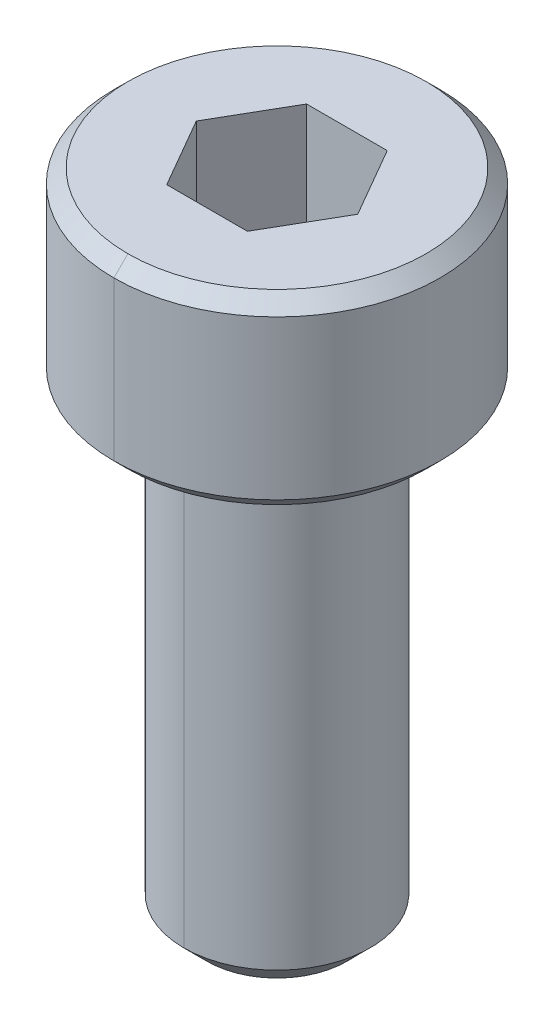
ISO-10303-21;
HEADER;
FILE_DESCRIPTION(('STEP AP214'),'2;1');
FILE_NAME('part.step','',(''),(''),'','','');
FILE_SCHEMA(('AUTOMOTIVE_DESIGN { 1 0 10303 214 1 1 1 1 }'));
ENDSEC;
DATA;
#1=APPLICATION_CONTEXT('core data for automotive mechanical design processes');
#2=APPLICATION_PROTOCOL_DEFINITION('international standard','automotive_design',2000,#1);
#3=PRODUCT_CONTEXT('',#1,'mechanical');
#4=PRODUCT('Part','Part','',(#3));
#5=PRODUCT_RELATED_PRODUCT_CATEGORY('part','',(#4));
#6=PRODUCT_DEFINITION_FORMATION('','',#4);
#7=PRODUCT_DEFINITION_CONTEXT('part definition',#1,'design');
#8=PRODUCT_DEFINITION('design','',#6,#7);
#9=PRODUCT_DEFINITION_SHAPE('','',#8);
#10=(LENGTH_UNIT() NAMED_UNIT(*) SI_UNIT(.MILLI.,.METRE.));
#11=(NAMED_UNIT(*) PLANE_ANGLE_UNIT() SI_UNIT($,.RADIAN.));
#12=(NAMED_UNIT(*) SI_UNIT($,.STERADIAN.) SOLID_ANGLE_UNIT());
#13=UNCERTAINTY_MEASURE_WITH_UNIT(LENGTH_MEASURE(1.E-05),#10,'distance_accuracy_value','');
#14=(GEOMETRIC_REPRESENTATION_CONTEXT(3) GLOBAL_UNCERTAINTY_ASSIGNED_CONTEXT((#13)) GLOBAL_UNIT_ASSIGNED_CONTEXT((#10,
#11,#12)) REPRESENTATION_CONTEXT('',''));
#15=CARTESIAN_POINT('',(0.,0.,0.));
#16=DIRECTION('',(0.,0.,1.));
#17=DIRECTION('',(1.,0.,0.));
#18=AXIS2_PLACEMENT_3D('',#15,#16,#17);
#19=CARTESIAN_POINT('',(0.866025403784439,11.,1.5));
#20=DIRECTION('',(0.866025403784439,0.,0.5));
#21=DIRECTION('',(0.5,0.,-0.866025403784439));
#22=AXIS2_PLACEMENT_3D('',#19,#20,#21);
#23=PLANE('',#22);
#24=DIRECTION('',(0.5,0.,-0.866025403784439));
#25=VECTOR('',#24,1.);
#26=CARTESIAN_POINT('',(0.866025403784439,11.,1.5));
#27=LINE('',#26,#25);
#28=CARTESIAN_POINT('',(0.866025403784439,11.,1.5));
#29=VERTEX_POINT('',#28);
#30=CARTESIAN_POINT('',(1.73205080756888,11.,0.));
#31=VERTEX_POINT('',#30);
#32=EDGE_CURVE('E179',#29,#31,#27,.T.);
#33=ORIENTED_EDGE('',*,*,#32,.F.);
#34=DIRECTION('',(0.,1.,0.));
#35=VECTOR('',#34,1.);
#36=CARTESIAN_POINT('',(0.866025403784439,11.,1.5));
#37=LINE('',#36,#35);
#38=CARTESIAN_POINT('',(0.866025403784439,14.,1.5));
#39=VERTEX_POINT('',#38);
#40=EDGE_CURVE('E167',#29,#39,#37,.T.);
#41=ORIENTED_EDGE('',*,*,#40,.T.);
#42=DIRECTION('',(0.5,0.,-0.866025403784439));
#43=VECTOR('',#42,1.);
#44=CARTESIAN_POINT('',(0.866025403784439,14.,1.5));
#45=LINE('',#44,#43);
#46=CARTESIAN_POINT('',(1.73205080756888,14.,0.));
#47=VERTEX_POINT('',#46);
#48=EDGE_CURVE('E181',#47,#39,#45,.F.);
#49=ORIENTED_EDGE('',*,*,#48,.F.);
#50=DIRECTION('',(0.,1.,0.));
#51=VECTOR('',#50,1.);
#52=CARTESIAN_POINT('',(1.73205080756888,11.,0.));
#53=LINE('',#52,#51);
#54=EDGE_CURVE('E174',#47,#31,#53,.F.);
#55=ORIENTED_EDGE('',*,*,#54,.T.);
#56=EDGE_LOOP('',(#33,#41,#49,#55));
#57=FACE_BOUND('',#56,.T.);
#58=ADVANCED_FACE('F17',(#57),#23,.F.);
#59=CARTESIAN_POINT('',(1.73205080756888,11.,0.));
#60=DIRECTION('',(0.866025403784438,0.,-0.5));
#61=DIRECTION('',(-0.5,0.,-0.866025403784438));
#62=AXIS2_PLACEMENT_3D('',#59,#60,#61);
#63=PLANE('',#62);
#64=DIRECTION('',(-0.5,0.,-0.866025403784438));
#65=VECTOR('',#64,1.);
#66=CARTESIAN_POINT('',(1.73205080756888,11.,0.));
#67=LINE('',#66,#65);
#68=CARTESIAN_POINT('',(0.866025403784438,11.,-1.5));
#69=VERTEX_POINT('',#68);
#70=EDGE_CURVE('E172',#31,#69,#67,.T.);
#71=ORIENTED_EDGE('',*,*,#70,.F.);
#72=ORIENTED_EDGE('',*,*,#54,.F.);
#73=DIRECTION('',(-0.5,0.,-0.866025403784438));
#74=VECTOR('',#73,1.);
#75=CARTESIAN_POINT('',(1.73205080756888,14.,0.));
#76=LINE('',#75,#74);
#77=CARTESIAN_POINT('',(0.866025403784439,14.,-1.5));
#78=VERTEX_POINT('',#77);
#79=EDGE_CURVE('E177',#78,#47,#76,.F.);
#80=ORIENTED_EDGE('',*,*,#79,.F.);
#81=DIRECTION('',(0.,1.,0.));
#82=VECTOR('',#81,1.);
#83=CARTESIAN_POINT('',(0.866025403784438,11.,-1.5));
#84=LINE('',#83,#82);
#85=EDGE_CURVE('E162',#78,#69,#84,.F.);
#86=ORIENTED_EDGE('',*,*,#85,.T.);
#87=EDGE_LOOP('',(#71,#72,#80,#86));
#88=FACE_BOUND('',#87,.T.);
#89=ADVANCED_FACE('F417',(#88),#63,.F.);
#90=CARTESIAN_POINT('',(-0.866025403784438,11.,1.5));
#91=DIRECTION('',(0.,0.,1.));
#92=DIRECTION('',(1.,0.,0.));
#93=AXIS2_PLACEMENT_3D('',#90,#91,#92);
#94=PLANE('',#93);
#95=DIRECTION('',(1.,0.,0.));
#96=VECTOR('',#95,1.);
#97=CARTESIAN_POINT('',(1.73205080756888,11.,1.5));
#98=LINE('',#97,#96);
#99=CARTESIAN_POINT('',(-0.866025403784438,11.,1.5));
#100=VERTEX_POINT('',#99);
#101=EDGE_CURVE('E159',#100,#29,#98,.T.);
#102=ORIENTED_EDGE('',*,*,#101,.F.);
#103=DIRECTION('',(0.,1.,0.));
#104=VECTOR('',#103,1.);
#105=CARTESIAN_POINT('',(-0.866025403784438,11.,1.5));
#106=LINE('',#105,#104);
#107=CARTESIAN_POINT('',(-0.866025403784438,14.,1.5));
#108=VERTEX_POINT('',#107);
#109=EDGE_CURVE('E148',#100,#108,#106,.T.);
#110=ORIENTED_EDGE('',*,*,#109,.T.);
#111=DIRECTION('',(1.,0.,0.));
#112=VECTOR('',#111,1.);
#113=CARTESIAN_POINT('',(-0.866025403784438,14.,1.5));
#114=LINE('',#113,#112);
#115=EDGE_CURVE('E170',#39,#108,#114,.F.);
#116=ORIENTED_EDGE('',*,*,#115,.F.);
#117=ORIENTED_EDGE('',*,*,#40,.F.);
#118=EDGE_LOOP('',(#102,#110,#116,#117));
#119=FACE_BOUND('',#118,.T.);
#120=ADVANCED_FACE('F408',(#119),#94,.F.);
#121=CARTESIAN_POINT('',(0.866025403784438,11.,-1.5));
#122=DIRECTION('',(0.,0.,-1.));
#123=DIRECTION('',(-1.,0.,0.));
#124=AXIS2_PLACEMENT_3D('',#121,#122,#123);
#125=PLANE('',#124);
#126=DIRECTION('',(1.,0.,0.));
#127=VECTOR('',#126,1.);
#128=CARTESIAN_POINT('',(1.73205080756888,11.,-1.5));
#129=LINE('',#128,#127);
#130=CARTESIAN_POINT('',(-0.866025403784438,11.,-1.5));
#131=VERTEX_POINT('',#130);
#132=EDGE_CURVE('E156',#69,#131,#129,.F.);
#133=ORIENTED_EDGE('',*,*,#132,.F.);
#134=ORIENTED_EDGE('',*,*,#85,.F.);
#135=DIRECTION('',(-1.,0.,0.));
#136=VECTOR('',#135,1.);
#137=CARTESIAN_POINT('',(0.866025403784438,14.,-1.5));
#138=LINE('',#137,#136);
#139=CARTESIAN_POINT('',(-0.866025403784438,14.,-1.5));
#140=VERTEX_POINT('',#139);
#141=EDGE_CURVE('E165',#140,#78,#138,.F.);
#142=ORIENTED_EDGE('',*,*,#141,.F.);
#143=DIRECTION('',(0.,1.,0.));
#144=VECTOR('',#143,1.);
#145=CARTESIAN_POINT('',(-0.866025403784438,11.,-1.5));
#146=LINE('',#145,#144);
#147=EDGE_CURVE('E146',#140,#131,#146,.F.);
#148=ORIENTED_EDGE('',*,*,#147,.T.);
#149=EDGE_LOOP('',(#133,#134,#142,#148));
#150=FACE_BOUND('',#149,.T.);
#151=ADVANCED_FACE('F399',(#150),#125,.F.);
#152=CARTESIAN_POINT('',(1.73205080756888,11.,0.));
#153=DIRECTION('',(0.,1.,0.));
#154=DIRECTION('',(0.,0.,1.));
#155=AXIS2_PLACEMENT_3D('',#152,#153,#154);
#156=PLANE('',#155);
#157=ORIENTED_EDGE('',*,*,#132,.T.);
#158=DIRECTION('',(-0.5,0.,0.866025403784439));
#159=VECTOR('',#158,1.);
#160=CARTESIAN_POINT('',(-0.866025403784438,11.,-1.5));
#161=LINE('',#160,#159);
#162=CARTESIAN_POINT('',(-1.73205080756888,11.,0.));
#163=VERTEX_POINT('',#162);
#164=EDGE_CURVE('E144',#131,#163,#161,.T.);
#165=ORIENTED_EDGE('',*,*,#164,.T.);
#166=DIRECTION('',(0.5,0.,0.866025403784439));
#167=VECTOR('',#166,1.);
#168=CARTESIAN_POINT('',(-1.73205080756888,11.,0.));
#169=LINE('',#168,#167);
#170=EDGE_CURVE('E151',#163,#100,#169,.T.);
#171=ORIENTED_EDGE('',*,*,#170,.T.);
#172=ORIENTED_EDGE('',*,*,#101,.T.);
#173=ORIENTED_EDGE('',*,*,#32,.T.);
#174=ORIENTED_EDGE('',*,*,#70,.T.);
#175=EDGE_LOOP('',(#157,#165,#171,#172,#173,#174));
#176=FACE_BOUND('',#175,.T.);
#177=ADVANCED_FACE('F390',(#176),#156,.T.);
#178=CARTESIAN_POINT('',(-1.73205080756888,11.,0.));
#179=DIRECTION('',(-0.866025403784439,0.,0.5));
#180=DIRECTION('',(0.5,0.,0.866025403784439));
#181=AXIS2_PLACEMENT_3D('',#178,#179,#180);
#182=PLANE('',#181);
#183=ORIENTED_EDGE('',*,*,#170,.F.);
#184=DIRECTION('',(0.,1.,0.));
#185=VECTOR('',#184,1.);
#186=CARTESIAN_POINT('',(-1.73205080756888,11.,0.));
#187=LINE('',#186,#185);
#188=CARTESIAN_POINT('',(-1.73205080756888,14.,0.));
#189=VERTEX_POINT('',#188);
#190=EDGE_CURVE('E141',#163,#189,#187,.T.);
#191=ORIENTED_EDGE('',*,*,#190,.T.);
#192=DIRECTION('',(0.5,0.,0.866025403784439));
#193=VECTOR('',#192,1.);
#194=CARTESIAN_POINT('',(-1.73205080756888,14.,0.));
#195=LINE('',#194,#193);
#196=EDGE_CURVE('E154',#108,#189,#195,.F.);
#197=ORIENTED_EDGE('',*,*,#196,.F.);
#198=ORIENTED_EDGE('',*,*,#109,.F.);
#199=EDGE_LOOP('',(#183,#191,#197,#198));
#200=FACE_BOUND('',#199,.T.);
#201=ADVANCED_FACE('F381',(#200),#182,.F.);
#202=CARTESIAN_POINT('',(-0.866025403784438,11.,-1.5));
#203=DIRECTION('',(-0.866025403784439,0.,-0.5));
#204=DIRECTION('',(-0.5,0.,0.866025403784439));
#205=AXIS2_PLACEMENT_3D('',#202,#203,#204);
#206=PLANE('',#205);
#207=ORIENTED_EDGE('',*,*,#164,.F.);
#208=ORIENTED_EDGE('',*,*,#147,.F.);
#209=DIRECTION('',(0.5,0.,-0.866025403784439));
#210=VECTOR('',#209,1.);
#211=CARTESIAN_POINT('',(-1.73205080756888,14.,0.));
#212=LINE('',#211,#210);
#213=EDGE_CURVE('E122',#189,#140,#212,.T.);
#214=ORIENTED_EDGE('',*,*,#213,.F.);
#215=ORIENTED_EDGE('',*,*,#190,.F.);
#216=EDGE_LOOP('',(#207,#208,#214,#215));
#217=FACE_BOUND('',#216,.T.);
#218=ADVANCED_FACE('F373',(#217),#206,.F.);
#219=CARTESIAN_POINT('',(0.,14.,-3.5));
#220=DIRECTION('',(0.,1.,0.));
#221=DIRECTION('',(0.,0.,1.));
#222=AXIS2_PLACEMENT_3D('',#219,#220,#221);
#223=PLANE('',#222);
#224=CARTESIAN_POINT('',(0.,13.9999999999532,0.));
#225=DIRECTION('',(0.,-1.,0.));
#226=DIRECTION('',(0.,0.,-1.));
#227=AXIS2_PLACEMENT_3D('',#224,#225,#226);
#228=CIRCLE('',#227,3.1999999999357);
#229=CARTESIAN_POINT('',(0.,13.9999999999532,-3.1999999999357));
#230=VERTEX_POINT('',#229);
#231=CARTESIAN_POINT('',(0.,13.9999999999532,3.1999999999357));
#232=VERTEX_POINT('',#231);
#233=EDGE_CURVE('E111',#230,#232,#228,.T.);
#234=ORIENTED_EDGE('',*,*,#233,.F.);
#235=CARTESIAN_POINT('',(0.,13.9999999999532,0.));
#236=DIRECTION('',(0.,-1.,0.));
#237=DIRECTION('',(0.,0.,-1.));
#238=AXIS2_PLACEMENT_3D('',#235,#236,#237);
#239=CIRCLE('',#238,3.1999999999357);
#240=EDGE_CURVE('E20',#232,#230,#239,.T.);
#241=ORIENTED_EDGE('',*,*,#240,.F.);
#242=EDGE_LOOP('',(#234,#241));
#243=FACE_BOUND('',#242,.T.);
#244=ORIENTED_EDGE('',*,*,#196,.T.);
#245=ORIENTED_EDGE('',*,*,#213,.T.);
#246=ORIENTED_EDGE('',*,*,#141,.T.);
#247=ORIENTED_EDGE('',*,*,#79,.T.);
#248=ORIENTED_EDGE('',*,*,#48,.T.);
#249=ORIENTED_EDGE('',*,*,#115,.T.);
#250=EDGE_LOOP('',(#244,#245,#246,#247,#248,#249));
#251=FACE_BOUND('',#250,.T.);
#252=ADVANCED_FACE('F112',(#243,#251),#223,.T.);
#253=CARTESIAN_POINT('',(0.,13.7000000000853,0.));
#254=DIRECTION('',(0.,-1.,0.));
#255=DIRECTION('',(0.,0.,-1.));
#256=AXIS2_PLACEMENT_3D('',#253,#254,#255);
#257=CONICAL_SURFACE('',#256,3.49999999980355,0.785398163397448);
#258=DIRECTION('',(0.,0.707106781186548,0.707106781186548));
#259=VECTOR('',#258,1.);
#260=CARTESIAN_POINT('',(0.,-498982.8,-499000.));
#261=LINE('',#260,#259);
#262=CARTESIAN_POINT('',(0.,13.7000000000213,-3.49999999995089));
#263=VERTEX_POINT('',#262);
#264=EDGE_CURVE('E120',#263,#230,#261,.T.);
#265=ORIENTED_EDGE('',*,*,#264,.F.);
#266=CARTESIAN_POINT('',(0.,13.7,0.));
#267=DIRECTION('',(0.,-1.,0.));
#268=DIRECTION('',(0.,0.,-1.));
#269=AXIS2_PLACEMENT_3D('',#266,#267,#268);
#270=CIRCLE('',#269,3.5);
#271=CARTESIAN_POINT('',(0.,13.7000000000213,3.49999999995089));
#272=VERTEX_POINT('',#271);
#273=EDGE_CURVE('E127',#272,#263,#270,.T.);
#274=ORIENTED_EDGE('',*,*,#273,.F.);
#275=DIRECTION('',(0.,0.707106781186548,-0.707106781186548));
#276=VECTOR('',#275,1.);
#277=CARTESIAN_POINT('',(6.11098752774529E-11,-498982.8,499000.));
#278=LINE('',#277,#276);
#279=EDGE_CURVE('E117',#232,#272,#278,.F.);
#280=ORIENTED_EDGE('',*,*,#279,.F.);
#281=ORIENTED_EDGE('',*,*,#240,.T.);
#282=EDGE_LOOP('',(#265,#274,#280,#281));
#283=FACE_BOUND('',#282,.T.);
#284=ADVANCED_FACE('F119',(#283),#257,.T.);
#285=CARTESIAN_POINT('',(0.,13.7000000000853,0.));
#286=DIRECTION('',(0.,-1.,0.));
#287=DIRECTION('',(0.,0.,-1.));
#288=AXIS2_PLACEMENT_3D('',#285,#286,#287);
#289=CONICAL_SURFACE('',#288,3.49999999980355,0.785398163397448);
#290=CARTESIAN_POINT('',(0.,13.7,0.));
#291=DIRECTION('',(0.,-1.,0.));
#292=DIRECTION('',(0.,0.,-1.));
#293=AXIS2_PLACEMENT_3D('',#290,#291,#292);
#294=CIRCLE('',#293,3.5);
#295=EDGE_CURVE('E125',#263,#272,#294,.T.);
#296=ORIENTED_EDGE('',*,*,#295,.F.);
#297=ORIENTED_EDGE('',*,*,#264,.T.);
#298=ORIENTED_EDGE('',*,*,#233,.T.);
#299=ORIENTED_EDGE('',*,*,#279,.T.);
#300=EDGE_LOOP('',(#296,#297,#298,#299));
#301=FACE_BOUND('',#300,.T.);
#302=ADVANCED_FACE('F123',(#301),#289,.T.);
#303=CARTESIAN_POINT('',(0.,0.,0.));
#304=DIRECTION('',(0.,-1.,0.));
#305=DIRECTION('',(0.,0.,-1.));
#306=AXIS2_PLACEMENT_3D('',#303,#304,#305);
#307=CYLINDRICAL_SURFACE('',#306,3.5);
#308=DIRECTION('',(0.,-1.,0.));
#309=VECTOR('',#308,1.);
#310=CARTESIAN_POINT('',(0.,0.,-3.5));
#311=LINE('',#310,#309);
#312=CARTESIAN_POINT('',(0.,10.2999999999298,-3.49999999995214));
#313=VERTEX_POINT('',#312);
#314=EDGE_CURVE('E226',#313,#263,#311,.F.);
#315=ORIENTED_EDGE('',*,*,#314,.F.);
#316=CARTESIAN_POINT('',(0.,10.2999999999724,0.));
#317=DIRECTION('',(0.,1.,0.));
#318=DIRECTION('',(0.,0.,1.));
#319=AXIS2_PLACEMENT_3D('',#316,#317,#318);
#320=CIRCLE('',#319,3.49999999997408);
#321=CARTESIAN_POINT('',(0.,10.299999999944,3.49999999995214));
#322=VERTEX_POINT('',#321);
#323=EDGE_CURVE('E221',#322,#313,#320,.F.);
#324=ORIENTED_EDGE('',*,*,#323,.F.);
#325=DIRECTION('',(0.,-1.,0.));
#326=VECTOR('',#325,1.);
#327=CARTESIAN_POINT('',(0.,0.,3.5));
#328=LINE('',#327,#326);
#329=EDGE_CURVE('E231',#272,#322,#328,.T.);
#330=ORIENTED_EDGE('',*,*,#329,.F.);
#331=ORIENTED_EDGE('',*,*,#273,.T.);
#332=EDGE_LOOP('',(#315,#324,#330,#331));
#333=FACE_BOUND('',#332,.T.);
#334=ADVANCED_FACE('F246',(#333),#307,.T.);
#335=CARTESIAN_POINT('',(0.,0.,0.));
#336=DIRECTION('',(0.,-1.,0.));
#337=DIRECTION('',(0.,0.,-1.));
#338=AXIS2_PLACEMENT_3D('',#335,#336,#337);
#339=CYLINDRICAL_SURFACE('',#338,3.5);
#340=CARTESIAN_POINT('',(0.,10.2999999999724,0.));
#341=DIRECTION('',(0.,1.,0.));
#342=DIRECTION('',(0.,0.,1.));
#343=AXIS2_PLACEMENT_3D('',#340,#341,#342);
#344=CIRCLE('',#343,3.49999999997408);
#345=EDGE_CURVE('E206',#313,#322,#344,.F.);
#346=ORIENTED_EDGE('',*,*,#345,.F.);
#347=ORIENTED_EDGE('',*,*,#314,.T.);
#348=ORIENTED_EDGE('',*,*,#295,.T.);
#349=ORIENTED_EDGE('',*,*,#329,.T.);
#350=EDGE_LOOP('',(#346,#347,#348,#349));
#351=FACE_BOUND('',#350,.T.);
#352=ADVANCED_FACE('F243',(#351),#339,.T.);
#353=CARTESIAN_POINT('',(0.,10.2999999998588,0.));
#354=DIRECTION('',(0.,1.,0.));
#355=DIRECTION('',(0.,0.,1.));
#356=AXIS2_PLACEMENT_3D('',#353,#354,#355);
#357=CONICAL_SURFACE('',#356,3.49999999986039,0.785398163397448);
#358=DIRECTION('',(0.,-0.707106781186548,-0.707106781186548));
#359=VECTOR('',#358,1.);
#360=CARTESIAN_POINT('',(0.,499000.,498993.2));
#361=LINE('',#360,#359);
#362=CARTESIAN_POINT('',(0.,9.99999999999091,3.19999999999254));
#363=VERTEX_POINT('',#362);
#364=EDGE_CURVE('E203',#322,#363,#361,.T.);
#365=ORIENTED_EDGE('',*,*,#364,.F.);
#366=ORIENTED_EDGE('',*,*,#323,.T.);
#367=DIRECTION('',(0.,-0.707106781186548,0.707106781186548));
#368=VECTOR('',#367,1.);
#369=CARTESIAN_POINT('',(6.11090425176295E-11,499000.,-498993.2));
#370=LINE('',#369,#368);
#371=CARTESIAN_POINT('',(0.,9.99999999999091,-3.19999999999254));
#372=VERTEX_POINT('',#371);
#373=EDGE_CURVE('E212',#372,#313,#370,.F.);
#374=ORIENTED_EDGE('',*,*,#373,.F.);
#375=CARTESIAN_POINT('',(0.,9.99999999999091,0.));
#376=DIRECTION('',(0.,1.,0.));
#377=DIRECTION('',(0.,0.,1.));
#378=AXIS2_PLACEMENT_3D('',#375,#376,#377);
#379=CIRCLE('',#378,3.19999999999254);
#380=EDGE_CURVE('E198',#363,#372,#379,.F.);
#381=ORIENTED_EDGE('',*,*,#380,.F.);
#382=EDGE_LOOP('',(#365,#366,#374,#381));
#383=FACE_BOUND('',#382,.T.);
#384=ADVANCED_FACE('F248',(#383),#357,.T.);
#385=CARTESIAN_POINT('',(0.,10.2999999998588,0.));
#386=DIRECTION('',(0.,1.,0.));
#387=DIRECTION('',(0.,0.,1.));
#388=AXIS2_PLACEMENT_3D('',#385,#386,#387);
#389=CONICAL_SURFACE('',#388,3.49999999986039,0.785398163397448);
#390=ORIENTED_EDGE('',*,*,#345,.T.);
#391=ORIENTED_EDGE('',*,*,#364,.T.);
#392=CARTESIAN_POINT('',(0.,9.99999999999091,0.));
#393=DIRECTION('',(0.,1.,0.));
#394=DIRECTION('',(0.,0.,1.));
#395=AXIS2_PLACEMENT_3D('',#392,#393,#394);
#396=CIRCLE('',#395,3.19999999999254);
#397=EDGE_CURVE('E195',#372,#363,#396,.F.);
#398=ORIENTED_EDGE('',*,*,#397,.F.);
#399=ORIENTED_EDGE('',*,*,#373,.T.);
#400=EDGE_LOOP('',(#390,#391,#398,#399));
#401=FACE_BOUND('',#400,.T.);
#402=ADVANCED_FACE('F249',(#401),#389,.T.);
#403=CARTESIAN_POINT('',(0.,0.,0.));
#404=DIRECTION('',(0.,-1.,0.));
#405=DIRECTION('',(0.,0.,-1.));
#406=AXIS2_PLACEMENT_3D('',#403,#404,#405);
#407=PLANE('',#406);
#408=CARTESIAN_POINT('',(0.,0.,0.));
#409=DIRECTION('',(0.,1.,0.));
#410=DIRECTION('',(0.,0.,1.));
#411=AXIS2_PLACEMENT_3D('',#408,#409,#410);
#412=CIRCLE('',#411,1.50000000002137);
#413=CARTESIAN_POINT('',(0.,0.,1.50000000002137));
#414=VERTEX_POINT('',#413);
#415=CARTESIAN_POINT('',(0.,0.,-1.50000000002137));
#416=VERTEX_POINT('',#415);
#417=EDGE_CURVE('E191',#414,#416,#412,.T.);
#418=ORIENTED_EDGE('',*,*,#417,.F.);
#419=CARTESIAN_POINT('',(0.,0.,0.));
#420=DIRECTION('',(0.,1.,0.));
#421=DIRECTION('',(0.,0.,1.));
#422=AXIS2_PLACEMENT_3D('',#419,#420,#421);
#423=CIRCLE('',#422,1.50000000002137);
#424=EDGE_CURVE('E201',#416,#414,#423,.T.);
#425=ORIENTED_EDGE('',*,*,#424,.F.);
#426=EDGE_LOOP('',(#418,#425));
#427=FACE_BOUND('',#426,.T.);
#428=ADVANCED_FACE('F271',(#427),#407,.T.);
#429=CARTESIAN_POINT('',(0.,0.499999999988177,0.));
#430=DIRECTION('',(0.,1.,0.));
#431=DIRECTION('',(0.,0.,1.));
#432=AXIS2_PLACEMENT_3D('',#429,#430,#431);
#433=CONICAL_SURFACE('',#432,2.00000000000955,0.785398163397448);
#434=DIRECTION('',(0.,-0.707106781146353,-0.707106781226742));
#435=VECTOR('',#434,1.);
#436=CARTESIAN_POINT('',(0.,498998.49994327,499000.));
#437=LINE('',#436,#435);
#438=CARTESIAN_POINT('',(0.,0.499999999992611,2.00000000000597));
#439=VERTEX_POINT('',#438);
#440=EDGE_CURVE('E190',#439,#414,#437,.T.);
#441=ORIENTED_EDGE('',*,*,#440,.F.);
#442=CARTESIAN_POINT('',(0.,0.500000000000002,0.));
#443=DIRECTION('',(0.,-1.,0.));
#444=DIRECTION('',(0.,0.,-1.));
#445=AXIS2_PLACEMENT_3D('',#442,#443,#444);
#446=CIRCLE('',#445,2.);
#447=CARTESIAN_POINT('',(0.,0.499999999991133,-2.00000000000716));
#448=VERTEX_POINT('',#447);
#449=EDGE_CURVE('E35',#448,#439,#446,.F.);
#450=ORIENTED_EDGE('',*,*,#449,.F.);
#451=DIRECTION('',(0.,-0.707106781146353,0.707106781226742));
#452=VECTOR('',#451,1.);
#453=CARTESIAN_POINT('',(6.11098752774529E-11,498998.49994327,-499000.));
#454=LINE('',#453,#452);
#455=EDGE_CURVE('E194',#416,#448,#454,.F.);
#456=ORIENTED_EDGE('',*,*,#455,.F.);
#457=ORIENTED_EDGE('',*,*,#424,.T.);
#458=EDGE_LOOP('',(#441,#450,#456,#457));
#459=FACE_BOUND('',#458,.T.);
#460=ADVANCED_FACE('F255',(#459),#433,.T.);
#461=CARTESIAN_POINT('',(0.,10.,-2.));
#462=DIRECTION('',(0.,-1.,0.));
#463=DIRECTION('',(0.,0.,-1.));
#464=AXIS2_PLACEMENT_3D('',#461,#462,#463);
#465=PLANE('',#464);
#466=ORIENTED_EDGE('',*,*,#380,.T.);
#467=ORIENTED_EDGE('',*,*,#397,.T.);
#468=EDGE_LOOP('',(#466,#467));
#469=FACE_BOUND('',#468,.T.);
#470=CARTESIAN_POINT('',(0.,10.,0.));
#471=DIRECTION('',(0.,-1.,0.));
#472=DIRECTION('',(0.,0.,-1.));
#473=AXIS2_PLACEMENT_3D('',#470,#471,#472);
#474=CIRCLE('',#473,2.);
#475=CARTESIAN_POINT('',(0.,10.,-2.));
#476=VERTEX_POINT('',#475);
#477=CARTESIAN_POINT('',(0.,10.,2.));
#478=VERTEX_POINT('',#477);
#479=EDGE_CURVE('E183',#476,#478,#474,.T.);
#480=ORIENTED_EDGE('',*,*,#479,.F.);
#481=CARTESIAN_POINT('',(0.,10.,0.));
#482=DIRECTION('',(0.,-1.,0.));
#483=DIRECTION('',(0.,0.,-1.));
#484=AXIS2_PLACEMENT_3D('',#481,#482,#483);
#485=CIRCLE('',#484,2.);
#486=EDGE_CURVE('E187',#478,#476,#485,.T.);
#487=ORIENTED_EDGE('',*,*,#486,.F.);
#488=EDGE_LOOP('',(#480,#487));
#489=FACE_BOUND('',#488,.T.);
#490=ADVANCED_FACE('F251',(#469,#489),#465,.T.);
#491=CARTESIAN_POINT('',(0.,0.499999999988177,0.));
#492=DIRECTION('',(0.,1.,0.));
#493=DIRECTION('',(0.,0.,1.));
#494=AXIS2_PLACEMENT_3D('',#491,#492,#493);
#495=CONICAL_SURFACE('',#494,2.00000000000955,0.785398163397448);
#496=CARTESIAN_POINT('',(0.,0.500000000000002,0.));
#497=DIRECTION('',(0.,-1.,0.));
#498=DIRECTION('',(0.,0.,-1.));
#499=AXIS2_PLACEMENT_3D('',#496,#497,#498);
#500=CIRCLE('',#499,2.);
#501=EDGE_CURVE('E26',#439,#448,#500,.F.);
#502=ORIENTED_EDGE('',*,*,#501,.F.);
#503=ORIENTED_EDGE('',*,*,#440,.T.);
#504=ORIENTED_EDGE('',*,*,#417,.T.);
#505=ORIENTED_EDGE('',*,*,#455,.T.);
#506=EDGE_LOOP('',(#502,#503,#504,#505));
#507=FACE_BOUND('',#506,.T.);
#508=ADVANCED_FACE('F254',(#507),#495,.T.);
#509=CARTESIAN_POINT('',(0.,0.,0.));
#510=DIRECTION('',(0.,-1.,0.));
#511=DIRECTION('',(0.,0.,-1.));
#512=AXIS2_PLACEMENT_3D('',#509,#510,#511);
#513=CYLINDRICAL_SURFACE('',#512,2.);
#514=DIRECTION('',(0.,-1.,0.));
#515=VECTOR('',#514,1.);
#516=CARTESIAN_POINT('',(0.,0.,-2.));
#517=LINE('',#516,#515);
#518=EDGE_CURVE('E11',#448,#476,#517,.F.);
#519=ORIENTED_EDGE('',*,*,#518,.F.);
#520=ORIENTED_EDGE('',*,*,#449,.T.);
#521=DIRECTION('',(0.,-1.,0.));
#522=VECTOR('',#521,1.);
#523=CARTESIAN_POINT('',(0.,0.,2.));
#524=LINE('',#523,#522);
#525=EDGE_CURVE('E186',#478,#439,#524,.T.);
#526=ORIENTED_EDGE('',*,*,#525,.F.);
#527=ORIENTED_EDGE('',*,*,#486,.T.);
#528=EDGE_LOOP('',(#519,#520,#526,#527));
#529=FACE_BOUND('',#528,.T.);
#530=ADVANCED_FACE('F262',(#529),#513,.T.);
#531=CARTESIAN_POINT('',(0.,0.,0.));
#532=DIRECTION('',(0.,-1.,0.));
#533=DIRECTION('',(0.,0.,-1.));
#534=AXIS2_PLACEMENT_3D('',#531,#532,#533);
#535=CYLINDRICAL_SURFACE('',#534,2.);
#536=ORIENTED_EDGE('',*,*,#501,.T.);
#537=ORIENTED_EDGE('',*,*,#518,.T.);
#538=ORIENTED_EDGE('',*,*,#479,.T.);
#539=ORIENTED_EDGE('',*,*,#525,.T.);
#540=EDGE_LOOP('',(#536,#537,#538,#539));
#541=FACE_BOUND('',#540,.T.);
#542=ADVANCED_FACE('F264',(#541),#535,.T.);
#543=CLOSED_SHELL('',(#58,#89,#120,#151,#177,#201,#218,#252,#284,#302,#334,#352,#384,#402,#428,
#460,#490,#508,#530,#542));
#544=MANIFOLD_SOLID_BREP('B1',#543);
#545=ADVANCED_BREP_SHAPE_REPRESENTATION('',(#18,#544),#14);
#546=SHAPE_DEFINITION_REPRESENTATION(#9,#545);
ENDSEC;
END-ISO-10303-21;
